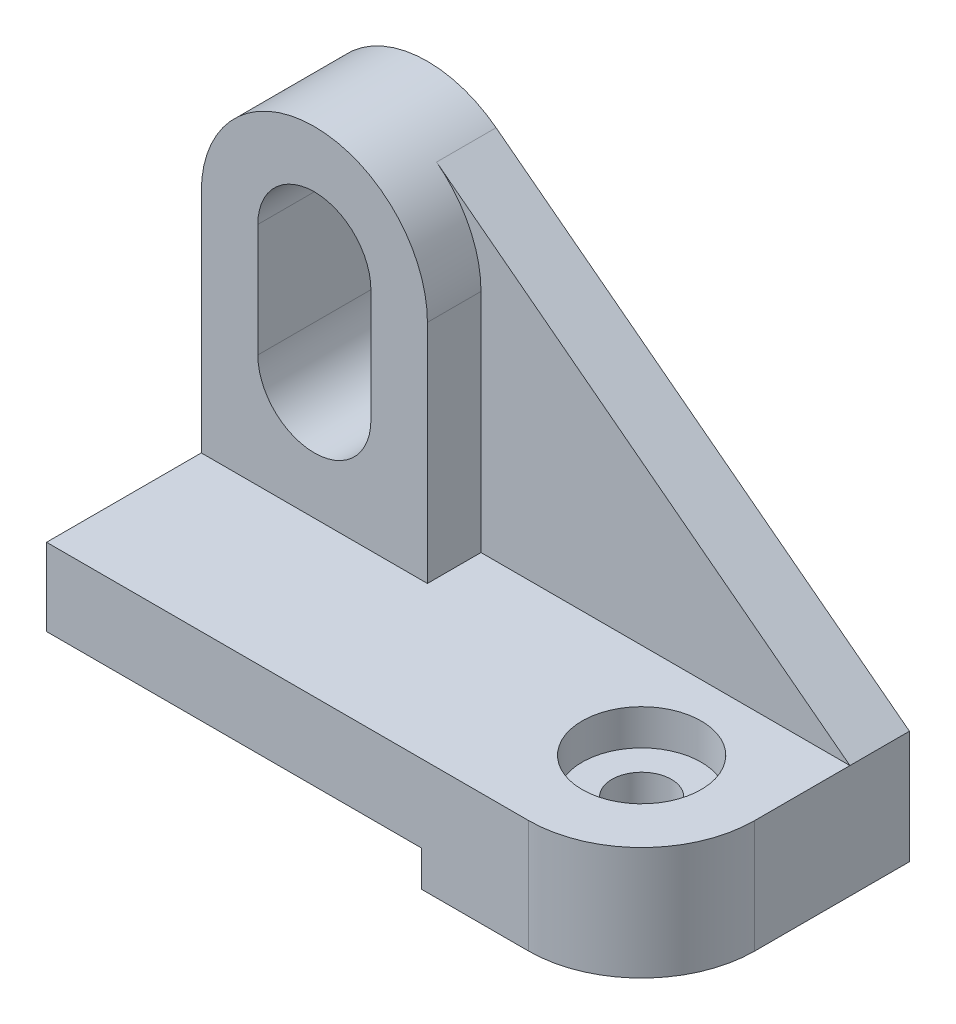
ISO-10303-21;
HEADER;
FILE_DESCRIPTION(('STEP AP214'),'2;1');
FILE_NAME('part.step','',(''),(''),'','','');
FILE_SCHEMA(('AUTOMOTIVE_DESIGN { 1 0 10303 214 1 1 1 1 }'));
ENDSEC;
DATA;
#1=APPLICATION_CONTEXT('core data for automotive mechanical design processes');
#2=APPLICATION_PROTOCOL_DEFINITION('international standard','automotive_design',2000,#1);
#3=PRODUCT_CONTEXT('',#1,'mechanical');
#4=PRODUCT('Part','Part','',(#3));
#5=PRODUCT_RELATED_PRODUCT_CATEGORY('part','',(#4));
#6=PRODUCT_DEFINITION_FORMATION('','',#4);
#7=PRODUCT_DEFINITION_CONTEXT('part definition',#1,'design');
#8=PRODUCT_DEFINITION('design','',#6,#7);
#9=PRODUCT_DEFINITION_SHAPE('','',#8);
#10=(LENGTH_UNIT() NAMED_UNIT(*) SI_UNIT(.MILLI.,.METRE.));
#11=(NAMED_UNIT(*) PLANE_ANGLE_UNIT() SI_UNIT($,.RADIAN.));
#12=(NAMED_UNIT(*) SI_UNIT($,.STERADIAN.) SOLID_ANGLE_UNIT());
#13=UNCERTAINTY_MEASURE_WITH_UNIT(LENGTH_MEASURE(1.E-05),#10,'distance_accuracy_value','');
#14=(GEOMETRIC_REPRESENTATION_CONTEXT(3) GLOBAL_UNCERTAINTY_ASSIGNED_CONTEXT((#13)) GLOBAL_UNIT_ASSIGNED_CONTEXT((#10,
#11,#12)) REPRESENTATION_CONTEXT('',''));
#15=CARTESIAN_POINT('',(0.,0.,0.));
#16=DIRECTION('',(0.,0.,1.));
#17=DIRECTION('',(1.,0.,0.));
#18=AXIS2_PLACEMENT_3D('',#15,#16,#17);
#19=CARTESIAN_POINT('',(0.,13.,45.));
#20=DIRECTION('',(0.,-1.,0.));
#21=DIRECTION('',(1.,0.,0.));
#22=AXIS2_PLACEMENT_3D('',#19,#20,#21);
#23=PLANE('',#22);
#24=CARTESIAN_POINT('',(81.,13.,26.));
#25=DIRECTION('',(0.,1.,0.));
#26=DIRECTION('',(0.,0.,1.));
#27=AXIS2_PLACEMENT_3D('',#24,#25,#26);
#28=CIRCLE('',#27,10.);
#29=CARTESIAN_POINT('',(81.,13.,36.));
#30=VERTEX_POINT('',#29);
#31=EDGE_CURVE('E344',#30,#30,#28,.T.);
#32=ORIENTED_EDGE('',*,*,#31,.F.);
#33=EDGE_LOOP('',(#32));
#34=FACE_BOUND('',#33,.T.);
#35=DIRECTION('',(-1.,0.,0.));
#36=VECTOR('',#35,1.);
#37=CARTESIAN_POINT('',(0.,13.,45.));
#38=LINE('',#37,#36);
#39=CARTESIAN_POINT('',(81.,13.,45.));
#40=VERTEX_POINT('',#39);
#41=CARTESIAN_POINT('',(0.,13.,45.));
#42=VERTEX_POINT('',#41);
#43=EDGE_CURVE('E268',#40,#42,#38,.T.);
#44=ORIENTED_EDGE('',*,*,#43,.F.);
#45=CARTESIAN_POINT('',(81.,13.,26.));
#46=DIRECTION('',(0.,-1.,0.));
#47=DIRECTION('',(1.,0.,0.));
#48=AXIS2_PLACEMENT_3D('',#45,#46,#47);
#49=CIRCLE('',#48,19.);
#50=CARTESIAN_POINT('',(100.,13.,26.));
#51=VERTEX_POINT('',#50);
#52=EDGE_CURVE('E71',#40,#51,#49,.F.);
#53=ORIENTED_EDGE('',*,*,#52,.T.);
#54=DIRECTION('',(0.,0.,-1.));
#55=VECTOR('',#54,1.);
#56=CARTESIAN_POINT('',(100.,13.,45.));
#57=LINE('',#56,#55);
#58=CARTESIAN_POINT('',(100.,13.,10.));
#59=VERTEX_POINT('',#58);
#60=EDGE_CURVE('E285',#51,#59,#57,.T.);
#61=ORIENTED_EDGE('',*,*,#60,.T.);
#62=DIRECTION('',(-1.,0.,0.));
#63=VECTOR('',#62,1.);
#64=CARTESIAN_POINT('',(0.,13.,10.));
#65=LINE('',#64,#63);
#66=CARTESIAN_POINT('',(38.,13.,10.));
#67=VERTEX_POINT('',#66);
#68=EDGE_CURVE('E330',#59,#67,#65,.T.);
#69=ORIENTED_EDGE('',*,*,#68,.T.);
#70=DIRECTION('',(0.,0.,-1.));
#71=VECTOR('',#70,1.);
#72=CARTESIAN_POINT('',(38.,13.,19.));
#73=LINE('',#72,#71);
#74=CARTESIAN_POINT('',(38.,13.,19.));
#75=VERTEX_POINT('',#74);
#76=EDGE_CURVE('E247',#75,#67,#73,.T.);
#77=ORIENTED_EDGE('',*,*,#76,.F.);
#78=DIRECTION('',(-1.,0.,0.));
#79=VECTOR('',#78,1.);
#80=CARTESIAN_POINT('',(0.,13.,19.));
#81=LINE('',#80,#79);
#82=CARTESIAN_POINT('',(0.,13.,19.));
#83=VERTEX_POINT('',#82);
#84=EDGE_CURVE('E228',#75,#83,#81,.T.);
#85=ORIENTED_EDGE('',*,*,#84,.T.);
#86=DIRECTION('',(0.,0.,-1.));
#87=VECTOR('',#86,1.);
#88=CARTESIAN_POINT('',(0.,13.,45.));
#89=LINE('',#88,#87);
#90=EDGE_CURVE('E317',#42,#83,#89,.T.);
#91=ORIENTED_EDGE('',*,*,#90,.F.);
#92=EDGE_LOOP('',(#44,#53,#61,#69,#77,#85,#91));
#93=FACE_BOUND('',#92,.T.);
#94=ADVANCED_FACE('F47',(#34,#93),#23,.F.);
#95=CARTESIAN_POINT('',(0.,0.,45.));
#96=DIRECTION('',(1.,0.,0.));
#97=DIRECTION('',(0.,1.,0.));
#98=AXIS2_PLACEMENT_3D('',#95,#96,#97);
#99=PLANE('',#98);
#100=DIRECTION('',(0.,-1.,0.));
#101=VECTOR('',#100,1.);
#102=CARTESIAN_POINT('',(0.,0.,0.));
#103=LINE('',#102,#101);
#104=CARTESIAN_POINT('',(0.,51.,0.));
#105=VERTEX_POINT('',#104);
#106=CARTESIAN_POINT('',(0.,0.,0.));
#107=VERTEX_POINT('',#106);
#108=EDGE_CURVE('E165',#105,#107,#103,.T.);
#109=ORIENTED_EDGE('',*,*,#108,.T.);
#110=DIRECTION('',(0.,0.,-1.));
#111=VECTOR('',#110,1.);
#112=CARTESIAN_POINT('',(0.,0.,45.));
#113=LINE('',#112,#111);
#114=CARTESIAN_POINT('',(0.,0.,45.));
#115=VERTEX_POINT('',#114);
#116=EDGE_CURVE('E313',#115,#107,#113,.T.);
#117=ORIENTED_EDGE('',*,*,#116,.F.);
#118=DIRECTION('',(0.,-1.,0.));
#119=VECTOR('',#118,1.);
#120=CARTESIAN_POINT('',(0.,0.,45.));
#121=LINE('',#120,#119);
#122=EDGE_CURVE('E271',#42,#115,#121,.T.);
#123=ORIENTED_EDGE('',*,*,#122,.F.);
#124=ORIENTED_EDGE('',*,*,#90,.T.);
#125=DIRECTION('',(0.,1.,0.));
#126=VECTOR('',#125,1.);
#127=CARTESIAN_POINT('',(0.,0.,19.));
#128=LINE('',#127,#126);
#129=CARTESIAN_POINT('',(0.,51.,19.));
#130=VERTEX_POINT('',#129);
#131=EDGE_CURVE('E224',#83,#130,#128,.T.);
#132=ORIENTED_EDGE('',*,*,#131,.T.);
#133=DIRECTION('',(0.,0.,-1.));
#134=VECTOR('',#133,1.);
#135=CARTESIAN_POINT('',(0.,51.,19.));
#136=LINE('',#135,#134);
#137=EDGE_CURVE('E251',#130,#105,#136,.T.);
#138=ORIENTED_EDGE('',*,*,#137,.T.);
#139=EDGE_LOOP('',(#109,#117,#123,#124,#132,#138));
#140=FACE_BOUND('',#139,.T.);
#141=ADVANCED_FACE('F352',(#140),#99,.F.);
#142=CARTESIAN_POINT('',(0.,0.,45.));
#143=DIRECTION('',(0.,1.,0.));
#144=DIRECTION('',(0.,0.,1.));
#145=AXIS2_PLACEMENT_3D('',#142,#143,#144);
#146=PLANE('',#145);
#147=DIRECTION('',(1.,0.,0.));
#148=VECTOR('',#147,1.);
#149=CARTESIAN_POINT('',(0.,0.,0.));
#150=LINE('',#149,#148);
#151=CARTESIAN_POINT('',(63.,0.,0.));
#152=VERTEX_POINT('',#151);
#153=EDGE_CURVE('E288',#107,#152,#150,.T.);
#154=ORIENTED_EDGE('',*,*,#153,.T.);
#155=DIRECTION('',(0.,0.,-1.));
#156=VECTOR('',#155,1.);
#157=CARTESIAN_POINT('',(63.,0.,45.));
#158=LINE('',#157,#156);
#159=CARTESIAN_POINT('',(63.,0.,45.));
#160=VERTEX_POINT('',#159);
#161=EDGE_CURVE('E309',#160,#152,#158,.T.);
#162=ORIENTED_EDGE('',*,*,#161,.F.);
#163=DIRECTION('',(1.,0.,0.));
#164=VECTOR('',#163,1.);
#165=CARTESIAN_POINT('',(0.,0.,45.));
#166=LINE('',#165,#164);
#167=EDGE_CURVE('E275',#115,#160,#166,.T.);
#168=ORIENTED_EDGE('',*,*,#167,.F.);
#169=ORIENTED_EDGE('',*,*,#116,.T.);
#170=EDGE_LOOP('',(#154,#162,#168,#169));
#171=FACE_BOUND('',#170,.T.);
#172=ADVANCED_FACE('F363',(#171),#146,.F.);
#173=CARTESIAN_POINT('',(63.,0.,45.));
#174=DIRECTION('',(1.,0.,0.));
#175=DIRECTION('',(0.,0.,-1.));
#176=AXIS2_PLACEMENT_3D('',#173,#174,#175);
#177=PLANE('',#176);
#178=DIRECTION('',(0.,-1.,0.));
#179=VECTOR('',#178,1.);
#180=CARTESIAN_POINT('',(63.,0.,0.));
#181=LINE('',#180,#179);
#182=CARTESIAN_POINT('',(63.,-6.,0.));
#183=VERTEX_POINT('',#182);
#184=EDGE_CURVE('E291',#152,#183,#181,.T.);
#185=ORIENTED_EDGE('',*,*,#184,.T.);
#186=DIRECTION('',(0.,0.,-1.));
#187=VECTOR('',#186,1.);
#188=CARTESIAN_POINT('',(63.,-6.,45.));
#189=LINE('',#188,#187);
#190=CARTESIAN_POINT('',(63.,-6.,45.));
#191=VERTEX_POINT('',#190);
#192=EDGE_CURVE('E305',#191,#183,#189,.T.);
#193=ORIENTED_EDGE('',*,*,#192,.F.);
#194=DIRECTION('',(0.,-1.,0.));
#195=VECTOR('',#194,1.);
#196=CARTESIAN_POINT('',(63.,0.,45.));
#197=LINE('',#196,#195);
#198=EDGE_CURVE('E278',#160,#191,#197,.T.);
#199=ORIENTED_EDGE('',*,*,#198,.F.);
#200=ORIENTED_EDGE('',*,*,#161,.T.);
#201=EDGE_LOOP('',(#185,#193,#199,#200));
#202=FACE_BOUND('',#201,.T.);
#203=ADVANCED_FACE('F368',(#202),#177,.F.);
#204=CARTESIAN_POINT('',(0.,-6.,45.));
#205=DIRECTION('',(0.,1.,0.));
#206=DIRECTION('',(0.,0.,1.));
#207=AXIS2_PLACEMENT_3D('',#204,#205,#206);
#208=PLANE('',#207);
#209=CARTESIAN_POINT('',(81.,-6.,26.));
#210=DIRECTION('',(0.,1.,0.));
#211=DIRECTION('',(0.,0.,1.));
#212=AXIS2_PLACEMENT_3D('',#209,#210,#211);
#213=CIRCLE('',#212,5.);
#214=CARTESIAN_POINT('',(81.,-6.,31.));
#215=VERTEX_POINT('',#214);
#216=EDGE_CURVE('E51',#215,#215,#213,.T.);
#217=ORIENTED_EDGE('',*,*,#216,.T.);
#218=EDGE_LOOP('',(#217));
#219=FACE_BOUND('',#218,.T.);
#220=DIRECTION('',(0.,0.,-1.));
#221=VECTOR('',#220,1.);
#222=CARTESIAN_POINT('',(100.,-6.,45.));
#223=LINE('',#222,#221);
#224=CARTESIAN_POINT('',(100.,-6.,26.));
#225=VERTEX_POINT('',#224);
#226=CARTESIAN_POINT('',(100.,-6.,0.));
#227=VERTEX_POINT('',#226);
#228=EDGE_CURVE('E302',#225,#227,#223,.T.);
#229=ORIENTED_EDGE('',*,*,#228,.F.);
#230=CARTESIAN_POINT('',(81.,-6.,26.));
#231=DIRECTION('',(0.,1.,0.));
#232=DIRECTION('',(0.,0.,1.));
#233=AXIS2_PLACEMENT_3D('',#230,#231,#232);
#234=CIRCLE('',#233,19.);
#235=CARTESIAN_POINT('',(81.,-6.,45.));
#236=VERTEX_POINT('',#235);
#237=EDGE_CURVE('E11',#225,#236,#234,.F.);
#238=ORIENTED_EDGE('',*,*,#237,.T.);
#239=DIRECTION('',(1.,0.,0.));
#240=VECTOR('',#239,1.);
#241=CARTESIAN_POINT('',(0.,-6.,45.));
#242=LINE('',#241,#240);
#243=EDGE_CURVE('E281',#191,#236,#242,.T.);
#244=ORIENTED_EDGE('',*,*,#243,.F.);
#245=ORIENTED_EDGE('',*,*,#192,.T.);
#246=DIRECTION('',(1.,0.,0.));
#247=VECTOR('',#246,1.);
#248=CARTESIAN_POINT('',(0.,-6.,0.));
#249=LINE('',#248,#247);
#250=EDGE_CURVE('E294',#183,#227,#249,.T.);
#251=ORIENTED_EDGE('',*,*,#250,.T.);
#252=EDGE_LOOP('',(#229,#238,#244,#245,#251));
#253=FACE_BOUND('',#252,.T.);
#254=ADVANCED_FACE('F372',(#219,#253),#208,.F.);
#255=CARTESIAN_POINT('',(100.,0.,45.));
#256=DIRECTION('',(-1.,0.,0.));
#257=DIRECTION('',(0.,0.,1.));
#258=AXIS2_PLACEMENT_3D('',#255,#256,#257);
#259=PLANE('',#258);
#260=ORIENTED_EDGE('',*,*,#60,.F.);
#261=DIRECTION('',(0.,1.,0.));
#262=VECTOR('',#261,1.);
#263=CARTESIAN_POINT('',(100.,-6.,26.));
#264=LINE('',#263,#262);
#265=EDGE_CURVE('E57',#51,#225,#264,.F.);
#266=ORIENTED_EDGE('',*,*,#265,.T.);
#267=ORIENTED_EDGE('',*,*,#228,.T.);
#268=DIRECTION('',(0.,1.,0.));
#269=VECTOR('',#268,1.);
#270=CARTESIAN_POINT('',(100.,0.,0.));
#271=LINE('',#270,#269);
#272=CARTESIAN_POINT('',(100.,13.,0.));
#273=VERTEX_POINT('',#272);
#274=EDGE_CURVE('E272',#227,#273,#271,.T.);
#275=ORIENTED_EDGE('',*,*,#274,.T.);
#276=DIRECTION('',(0.,0.,-1.));
#277=VECTOR('',#276,1.);
#278=CARTESIAN_POINT('',(100.,13.,10.));
#279=LINE('',#278,#277);
#280=EDGE_CURVE('E183',#59,#273,#279,.T.);
#281=ORIENTED_EDGE('',*,*,#280,.F.);
#282=EDGE_LOOP('',(#260,#266,#267,#275,#281));
#283=FACE_BOUND('',#282,.T.);
#284=ADVANCED_FACE('F421',(#283),#259,.F.);
#285=CARTESIAN_POINT('',(0.,0.,45.));
#286=DIRECTION('',(0.,0.,1.));
#287=DIRECTION('',(1.,0.,0.));
#288=AXIS2_PLACEMENT_3D('',#285,#286,#287);
#289=PLANE('',#288);
#290=ORIENTED_EDGE('',*,*,#243,.T.);
#291=DIRECTION('',(0.,1.,0.));
#292=VECTOR('',#291,1.);
#293=CARTESIAN_POINT('',(81.,13.,45.));
#294=LINE('',#293,#292);
#295=EDGE_CURVE('E321',#236,#40,#294,.T.);
#296=ORIENTED_EDGE('',*,*,#295,.T.);
#297=ORIENTED_EDGE('',*,*,#43,.T.);
#298=ORIENTED_EDGE('',*,*,#122,.T.);
#299=ORIENTED_EDGE('',*,*,#167,.T.);
#300=ORIENTED_EDGE('',*,*,#198,.T.);
#301=EDGE_LOOP('',(#290,#296,#297,#298,#299,#300));
#302=FACE_BOUND('',#301,.T.);
#303=ADVANCED_FACE('F356',(#302),#289,.T.);
#304=CARTESIAN_POINT('',(0.,0.,0.));
#305=DIRECTION('',(0.,0.,1.));
#306=DIRECTION('',(1.,0.,0.));
#307=AXIS2_PLACEMENT_3D('',#304,#305,#306);
#308=PLANE('',#307);
#309=DIRECTION('',(0.79448191507605,-0.607287812010987,0.));
#310=VECTOR('',#309,1.);
#311=CARTESIAN_POINT('',(43.152078052264,56.4535380628611,0.));
#312=LINE('',#311,#310);
#313=CARTESIAN_POINT('',(30.5384684282088,66.0951563864449,0.));
#314=VERTEX_POINT('',#313);
#315=EDGE_CURVE('E163',#314,#273,#312,.T.);
#316=ORIENTED_EDGE('',*,*,#315,.T.);
#317=ORIENTED_EDGE('',*,*,#274,.F.);
#318=ORIENTED_EDGE('',*,*,#250,.F.);
#319=ORIENTED_EDGE('',*,*,#184,.F.);
#320=ORIENTED_EDGE('',*,*,#153,.F.);
#321=ORIENTED_EDGE('',*,*,#108,.F.);
#322=CARTESIAN_POINT('',(19.,51.,0.));
#323=DIRECTION('',(0.,0.,1.));
#324=DIRECTION('',(1.,0.,0.));
#325=AXIS2_PLACEMENT_3D('',#322,#323,#324);
#326=CIRCLE('',#325,19.);
#327=EDGE_CURVE('E157',#314,#105,#326,.T.);
#328=ORIENTED_EDGE('',*,*,#327,.F.);
#329=EDGE_LOOP('',(#316,#317,#318,#319,#320,#321,#328));
#330=FACE_BOUND('',#329,.T.);
#331=CARTESIAN_POINT('',(19.,32.,0.));
#332=DIRECTION('',(0.,0.,1.));
#333=DIRECTION('',(1.,0.,0.));
#334=AXIS2_PLACEMENT_3D('',#331,#332,#333);
#335=CIRCLE('',#334,9.5);
#336=CARTESIAN_POINT('',(9.5,32.,0.));
#337=VERTEX_POINT('',#336);
#338=CARTESIAN_POINT('',(28.5,32.,0.));
#339=VERTEX_POINT('',#338);
#340=EDGE_CURVE('E202',#337,#339,#335,.T.);
#341=ORIENTED_EDGE('',*,*,#340,.T.);
#342=DIRECTION('',(0.,-1.,0.));
#343=VECTOR('',#342,1.);
#344=CARTESIAN_POINT('',(28.5,0.,0.));
#345=LINE('',#344,#343);
#346=CARTESIAN_POINT('',(28.5,51.,0.));
#347=VERTEX_POINT('',#346);
#348=EDGE_CURVE('E171',#347,#339,#345,.T.);
#349=ORIENTED_EDGE('',*,*,#348,.F.);
#350=CARTESIAN_POINT('',(19.,51.,0.));
#351=DIRECTION('',(0.,0.,1.));
#352=DIRECTION('',(1.,0.,0.));
#353=AXIS2_PLACEMENT_3D('',#350,#351,#352);
#354=CIRCLE('',#353,9.5);
#355=CARTESIAN_POINT('',(9.5,51.,0.));
#356=VERTEX_POINT('',#355);
#357=EDGE_CURVE('E240',#347,#356,#354,.T.);
#358=ORIENTED_EDGE('',*,*,#357,.T.);
#359=DIRECTION('',(0.,-1.,0.));
#360=VECTOR('',#359,1.);
#361=CARTESIAN_POINT('',(9.5,0.,0.));
#362=LINE('',#361,#360);
#363=EDGE_CURVE('E236',#356,#337,#362,.T.);
#364=ORIENTED_EDGE('',*,*,#363,.T.);
#365=EDGE_LOOP('',(#341,#349,#358,#364));
#366=FACE_BOUND('',#365,.T.);
#367=ADVANCED_FACE('F159',(#330,#366),#308,.F.);
#368=CARTESIAN_POINT('',(38.,0.,19.));
#369=DIRECTION('',(-1.,0.,0.));
#370=DIRECTION('',(0.,-1.,0.));
#371=AXIS2_PLACEMENT_3D('',#368,#369,#370);
#372=PLANE('',#371);
#373=ORIENTED_EDGE('',*,*,#76,.T.);
#374=DIRECTION('',(0.,1.,0.));
#375=VECTOR('',#374,1.);
#376=CARTESIAN_POINT('',(38.,0.,10.));
#377=LINE('',#376,#375);
#378=CARTESIAN_POINT('',(38.,51.,10.));
#379=VERTEX_POINT('',#378);
#380=EDGE_CURVE('E193',#67,#379,#377,.T.);
#381=ORIENTED_EDGE('',*,*,#380,.T.);
#382=DIRECTION('',(0.,0.,-1.));
#383=VECTOR('',#382,1.);
#384=CARTESIAN_POINT('',(38.,51.,19.));
#385=LINE('',#384,#383);
#386=CARTESIAN_POINT('',(38.,51.,19.));
#387=VERTEX_POINT('',#386);
#388=EDGE_CURVE('E255',#387,#379,#385,.T.);
#389=ORIENTED_EDGE('',*,*,#388,.F.);
#390=DIRECTION('',(0.,1.,0.));
#391=VECTOR('',#390,1.);
#392=CARTESIAN_POINT('',(38.,0.,19.));
#393=LINE('',#392,#391);
#394=EDGE_CURVE('E217',#75,#387,#393,.T.);
#395=ORIENTED_EDGE('',*,*,#394,.F.);
#396=EDGE_LOOP('',(#373,#381,#389,#395));
#397=FACE_BOUND('',#396,.T.);
#398=ADVANCED_FACE('F403',(#397),#372,.F.);
#399=CARTESIAN_POINT('',(19.,51.,19.));
#400=DIRECTION('',(0.,0.,-1.));
#401=DIRECTION('',(-1.,0.,0.));
#402=AXIS2_PLACEMENT_3D('',#399,#400,#401);
#403=CYLINDRICAL_SURFACE('',#402,19.);
#404=CARTESIAN_POINT('',(19.,51.,10.));
#405=DIRECTION('',(0.,0.,1.));
#406=DIRECTION('',(1.,0.,0.));
#407=AXIS2_PLACEMENT_3D('',#404,#405,#406);
#408=CIRCLE('',#407,19.);
#409=CARTESIAN_POINT('',(30.5384684282088,66.0951563864449,10.));
#410=VERTEX_POINT('',#409);
#411=EDGE_CURVE('E178',#379,#410,#408,.T.);
#412=ORIENTED_EDGE('',*,*,#411,.T.);
#413=DIRECTION('',(0.,0.,-1.));
#414=VECTOR('',#413,1.);
#415=CARTESIAN_POINT('',(30.5384684282088,66.0951563864449,10.));
#416=LINE('',#415,#414);
#417=EDGE_CURVE('E174',#410,#314,#416,.T.);
#418=ORIENTED_EDGE('',*,*,#417,.T.);
#419=ORIENTED_EDGE('',*,*,#327,.T.);
#420=ORIENTED_EDGE('',*,*,#137,.F.);
#421=CARTESIAN_POINT('',(19.,51.,19.));
#422=DIRECTION('',(0.,0.,1.));
#423=DIRECTION('',(1.,0.,0.));
#424=AXIS2_PLACEMENT_3D('',#421,#422,#423);
#425=CIRCLE('',#424,19.);
#426=EDGE_CURVE('E221',#387,#130,#425,.T.);
#427=ORIENTED_EDGE('',*,*,#426,.F.);
#428=ORIENTED_EDGE('',*,*,#388,.T.);
#429=EDGE_LOOP('',(#412,#418,#419,#420,#427,#428));
#430=FACE_BOUND('',#429,.T.);
#431=ADVANCED_FACE('F175',(#430),#403,.T.);
#432=CARTESIAN_POINT('',(19.,32.,19.));
#433=DIRECTION('',(0.,0.,-1.));
#434=DIRECTION('',(-1.,0.,0.));
#435=AXIS2_PLACEMENT_3D('',#432,#433,#434);
#436=CYLINDRICAL_SURFACE('',#435,9.5);
#437=ORIENTED_EDGE('',*,*,#340,.F.);
#438=DIRECTION('',(0.,0.,-1.));
#439=VECTOR('',#438,1.);
#440=CARTESIAN_POINT('',(9.5,32.,19.));
#441=LINE('',#440,#439);
#442=CARTESIAN_POINT('',(9.5,32.,19.));
#443=VERTEX_POINT('',#442);
#444=EDGE_CURVE('E252',#443,#337,#441,.T.);
#445=ORIENTED_EDGE('',*,*,#444,.F.);
#446=CARTESIAN_POINT('',(19.,32.,19.));
#447=DIRECTION('',(0.,0.,1.));
#448=DIRECTION('',(1.,0.,0.));
#449=AXIS2_PLACEMENT_3D('',#446,#447,#448);
#450=CIRCLE('',#449,9.5);
#451=CARTESIAN_POINT('',(28.5,32.,19.));
#452=VERTEX_POINT('',#451);
#453=EDGE_CURVE('E170',#443,#452,#450,.T.);
#454=ORIENTED_EDGE('',*,*,#453,.T.);
#455=DIRECTION('',(0.,0.,-1.));
#456=VECTOR('',#455,1.);
#457=CARTESIAN_POINT('',(28.5,32.,19.));
#458=LINE('',#457,#456);
#459=EDGE_CURVE('E232',#452,#339,#458,.T.);
#460=ORIENTED_EDGE('',*,*,#459,.T.);
#461=EDGE_LOOP('',(#437,#445,#454,#460));
#462=FACE_BOUND('',#461,.T.);
#463=ADVANCED_FACE('F402',(#462),#436,.F.);
#464=CARTESIAN_POINT('',(9.5,0.,19.));
#465=DIRECTION('',(1.,0.,0.));
#466=DIRECTION('',(0.,0.,-1.));
#467=AXIS2_PLACEMENT_3D('',#464,#465,#466);
#468=PLANE('',#467);
#469=ORIENTED_EDGE('',*,*,#363,.F.);
#470=DIRECTION('',(0.,0.,-1.));
#471=VECTOR('',#470,1.);
#472=CARTESIAN_POINT('',(9.5,51.,19.));
#473=LINE('',#472,#471);
#474=CARTESIAN_POINT('',(9.5,51.,19.));
#475=VERTEX_POINT('',#474);
#476=EDGE_CURVE('E263',#475,#356,#473,.T.);
#477=ORIENTED_EDGE('',*,*,#476,.F.);
#478=DIRECTION('',(0.,-1.,0.));
#479=VECTOR('',#478,1.);
#480=CARTESIAN_POINT('',(9.5,0.,19.));
#481=LINE('',#480,#479);
#482=EDGE_CURVE('E206',#475,#443,#481,.T.);
#483=ORIENTED_EDGE('',*,*,#482,.T.);
#484=ORIENTED_EDGE('',*,*,#444,.T.);
#485=EDGE_LOOP('',(#469,#477,#483,#484));
#486=FACE_BOUND('',#485,.T.);
#487=ADVANCED_FACE('F412',(#486),#468,.T.);
#488=CARTESIAN_POINT('',(19.,51.,19.));
#489=DIRECTION('',(0.,0.,-1.));
#490=DIRECTION('',(-1.,0.,0.));
#491=AXIS2_PLACEMENT_3D('',#488,#489,#490);
#492=CYLINDRICAL_SURFACE('',#491,9.5);
#493=ORIENTED_EDGE('',*,*,#357,.F.);
#494=DIRECTION('',(0.,0.,-1.));
#495=VECTOR('',#494,1.);
#496=CARTESIAN_POINT('',(28.5,51.,19.));
#497=LINE('',#496,#495);
#498=CARTESIAN_POINT('',(28.5,51.,19.));
#499=VERTEX_POINT('',#498);
#500=EDGE_CURVE('E260',#499,#347,#497,.T.);
#501=ORIENTED_EDGE('',*,*,#500,.F.);
#502=CARTESIAN_POINT('',(19.,51.,19.));
#503=DIRECTION('',(0.,0.,1.));
#504=DIRECTION('',(1.,0.,0.));
#505=AXIS2_PLACEMENT_3D('',#502,#503,#504);
#506=CIRCLE('',#505,9.5);
#507=EDGE_CURVE('E210',#499,#475,#506,.T.);
#508=ORIENTED_EDGE('',*,*,#507,.T.);
#509=ORIENTED_EDGE('',*,*,#476,.T.);
#510=EDGE_LOOP('',(#493,#501,#508,#509));
#511=FACE_BOUND('',#510,.T.);
#512=ADVANCED_FACE('F408',(#511),#492,.F.);
#513=CARTESIAN_POINT('',(28.5,0.,19.));
#514=DIRECTION('',(1.,0.,0.));
#515=DIRECTION('',(0.,1.,0.));
#516=AXIS2_PLACEMENT_3D('',#513,#514,#515);
#517=PLANE('',#516);
#518=ORIENTED_EDGE('',*,*,#348,.T.);
#519=ORIENTED_EDGE('',*,*,#459,.F.);
#520=DIRECTION('',(0.,-1.,0.));
#521=VECTOR('',#520,1.);
#522=CARTESIAN_POINT('',(28.5,0.,19.));
#523=LINE('',#522,#521);
#524=EDGE_CURVE('E214',#499,#452,#523,.T.);
#525=ORIENTED_EDGE('',*,*,#524,.F.);
#526=ORIENTED_EDGE('',*,*,#500,.T.);
#527=EDGE_LOOP('',(#518,#519,#525,#526));
#528=FACE_BOUND('',#527,.T.);
#529=ADVANCED_FACE('F398',(#528),#517,.F.);
#530=CARTESIAN_POINT('',(0.,0.,19.));
#531=DIRECTION('',(0.,0.,1.));
#532=DIRECTION('',(1.,0.,0.));
#533=AXIS2_PLACEMENT_3D('',#530,#531,#532);
#534=PLANE('',#533);
#535=ORIENTED_EDGE('',*,*,#453,.F.);
#536=ORIENTED_EDGE('',*,*,#482,.F.);
#537=ORIENTED_EDGE('',*,*,#507,.F.);
#538=ORIENTED_EDGE('',*,*,#524,.T.);
#539=EDGE_LOOP('',(#535,#536,#537,#538));
#540=FACE_BOUND('',#539,.T.);
#541=ORIENTED_EDGE('',*,*,#394,.T.);
#542=ORIENTED_EDGE('',*,*,#426,.T.);
#543=ORIENTED_EDGE('',*,*,#131,.F.);
#544=ORIENTED_EDGE('',*,*,#84,.F.);
#545=EDGE_LOOP('',(#541,#542,#543,#544));
#546=FACE_BOUND('',#545,.T.);
#547=ADVANCED_FACE('F392',(#540,#546),#534,.T.);
#548=CARTESIAN_POINT('',(43.152078052264,56.4535380628611,10.));
#549=DIRECTION('',(0.607287812010987,0.79448191507605,0.));
#550=DIRECTION('',(-0.79448191507605,0.607287812010987,0.));
#551=AXIS2_PLACEMENT_3D('',#548,#549,#550);
#552=PLANE('',#551);
#553=ORIENTED_EDGE('',*,*,#315,.F.);
#554=ORIENTED_EDGE('',*,*,#417,.F.);
#555=DIRECTION('',(0.79448191507605,-0.607287812010987,0.));
#556=VECTOR('',#555,1.);
#557=CARTESIAN_POINT('',(43.152078052264,56.4535380628611,10.));
#558=LINE('',#557,#556);
#559=EDGE_CURVE('E184',#410,#59,#558,.T.);
#560=ORIENTED_EDGE('',*,*,#559,.T.);
#561=ORIENTED_EDGE('',*,*,#280,.T.);
#562=EDGE_LOOP('',(#553,#554,#560,#561));
#563=FACE_BOUND('',#562,.T.);
#564=ADVANCED_FACE('F187',(#563),#552,.T.);
#565=CARTESIAN_POINT('',(0.,0.,10.));
#566=DIRECTION('',(0.,0.,1.));
#567=DIRECTION('',(1.,0.,0.));
#568=AXIS2_PLACEMENT_3D('',#565,#566,#567);
#569=PLANE('',#568);
#570=ORIENTED_EDGE('',*,*,#411,.F.);
#571=ORIENTED_EDGE('',*,*,#380,.F.);
#572=ORIENTED_EDGE('',*,*,#68,.F.);
#573=ORIENTED_EDGE('',*,*,#559,.F.);
#574=EDGE_LOOP('',(#570,#571,#572,#573));
#575=FACE_BOUND('',#574,.T.);
#576=ADVANCED_FACE('F377',(#575),#569,.T.);
#577=CARTESIAN_POINT('',(81.,0.,26.));
#578=DIRECTION('',(0.,-1.,0.));
#579=DIRECTION('',(0.,0.,-1.));
#580=AXIS2_PLACEMENT_3D('',#577,#578,#579);
#581=CYLINDRICAL_SURFACE('',#580,19.);
#582=ORIENTED_EDGE('',*,*,#237,.F.);
#583=ORIENTED_EDGE('',*,*,#265,.F.);
#584=ORIENTED_EDGE('',*,*,#52,.F.);
#585=ORIENTED_EDGE('',*,*,#295,.F.);
#586=EDGE_LOOP('',(#582,#583,#584,#585));
#587=FACE_BOUND('',#586,.T.);
#588=ADVANCED_FACE('F49',(#587),#581,.T.);
#589=CARTESIAN_POINT('',(81.,13.,26.));
#590=DIRECTION('',(0.,1.,0.));
#591=DIRECTION('',(0.,0.,1.));
#592=AXIS2_PLACEMENT_3D('',#589,#590,#591);
#593=CYLINDRICAL_SURFACE('',#592,5.);
#594=CARTESIAN_POINT('',(81.,7.00000000000001,26.));
#595=DIRECTION('',(0.,1.,0.));
#596=DIRECTION('',(0.,0.,1.));
#597=AXIS2_PLACEMENT_3D('',#594,#595,#596);
#598=CIRCLE('',#597,5.);
#599=CARTESIAN_POINT('',(81.,7.00000000000001,31.));
#600=VERTEX_POINT('',#599);
#601=EDGE_CURVE('E196',#600,#600,#598,.T.);
#602=ORIENTED_EDGE('',*,*,#601,.T.);
#603=EDGE_LOOP('',(#602));
#604=FACE_BOUND('',#603,.T.);
#605=ORIENTED_EDGE('',*,*,#216,.F.);
#606=EDGE_LOOP('',(#605));
#607=FACE_BOUND('',#606,.T.);
#608=ADVANCED_FACE('F376',(#604,#607),#593,.F.);
#609=CARTESIAN_POINT('',(86.,7.00000000000001,26.));
#610=DIRECTION('',(0.,-1.,0.));
#611=DIRECTION('',(0.,0.,-1.));
#612=AXIS2_PLACEMENT_3D('',#609,#610,#611);
#613=PLANE('',#612);
#614=ORIENTED_EDGE('',*,*,#601,.F.);
#615=EDGE_LOOP('',(#614));
#616=FACE_BOUND('',#615,.T.);
#617=CARTESIAN_POINT('',(81.,7.00000000000001,26.));
#618=DIRECTION('',(0.,1.,0.));
#619=DIRECTION('',(0.,0.,1.));
#620=AXIS2_PLACEMENT_3D('',#617,#618,#619);
#621=CIRCLE('',#620,9.99999999999999);
#622=CARTESIAN_POINT('',(81.,7.00000000000001,36.));
#623=VERTEX_POINT('',#622);
#624=EDGE_CURVE('E340',#623,#623,#621,.T.);
#625=ORIENTED_EDGE('',*,*,#624,.T.);
#626=EDGE_LOOP('',(#625));
#627=FACE_BOUND('',#626,.T.);
#628=ADVANCED_FACE('F382',(#616,#627),#613,.F.);
#629=CARTESIAN_POINT('',(81.,13.,26.));
#630=DIRECTION('',(0.,1.,0.));
#631=DIRECTION('',(0.,0.,1.));
#632=AXIS2_PLACEMENT_3D('',#629,#630,#631);
#633=CYLINDRICAL_SURFACE('',#632,10.);
#634=ORIENTED_EDGE('',*,*,#624,.F.);
#635=EDGE_LOOP('',(#634));
#636=FACE_BOUND('',#635,.T.);
#637=ORIENTED_EDGE('',*,*,#31,.T.);
#638=EDGE_LOOP('',(#637));
#639=FACE_BOUND('',#638,.T.);
#640=ADVANCED_FACE('F349',(#636,#639),#633,.F.);
#641=CLOSED_SHELL('',(#94,#141,#172,#203,#254,#284,#303,#367,#398,#431,#463,#487,#512,#529,#547,
#564,#576,#588,#608,#628,#640));
#642=MANIFOLD_SOLID_BREP('B2',#641);
#643=ADVANCED_BREP_SHAPE_REPRESENTATION('',(#18,#642),#14);
#644=SHAPE_DEFINITION_REPRESENTATION(#9,#643);
ENDSEC;
END-ISO-10303-21;
